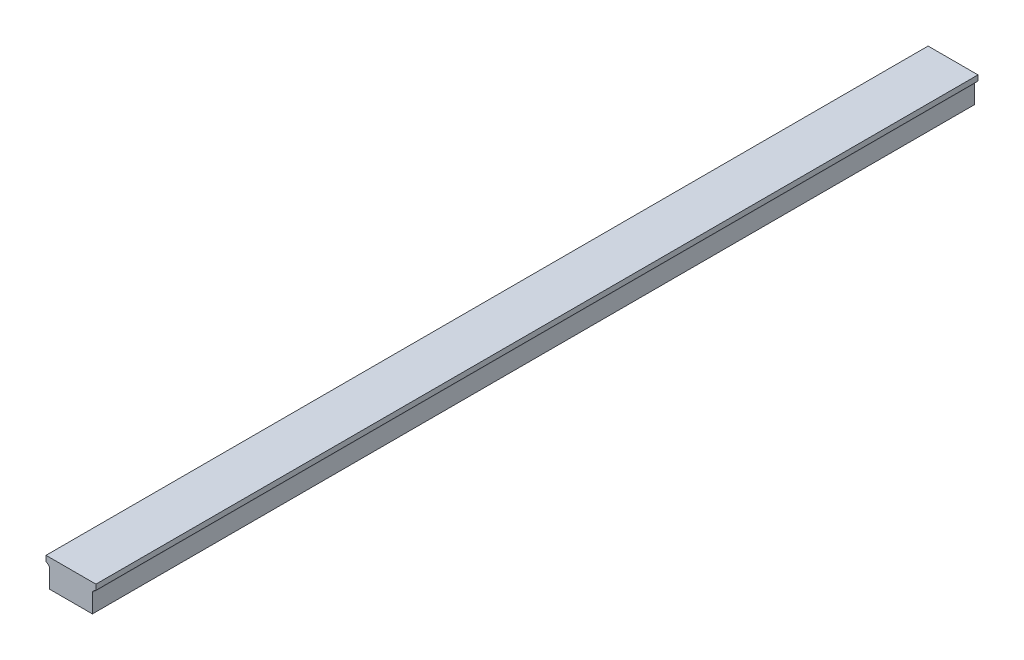
ISO-10303-21;
HEADER;
FILE_DESCRIPTION(('STEP AP214'),'2;1');
FILE_NAME('part.step','',(''),(''),'','','');
FILE_SCHEMA(('AUTOMOTIVE_DESIGN { 1 0 10303 214 1 1 1 1 }'));
ENDSEC;
DATA;
#1=APPLICATION_CONTEXT('core data for automotive mechanical design processes');
#2=APPLICATION_PROTOCOL_DEFINITION('international standard','automotive_design',2000,#1);
#3=PRODUCT_CONTEXT('',#1,'mechanical');
#4=PRODUCT('Part','Part','',(#3));
#5=PRODUCT_RELATED_PRODUCT_CATEGORY('part','',(#4));
#6=PRODUCT_DEFINITION_FORMATION('','',#4);
#7=PRODUCT_DEFINITION_CONTEXT('part definition',#1,'design');
#8=PRODUCT_DEFINITION('design','',#6,#7);
#9=PRODUCT_DEFINITION_SHAPE('','',#8);
#10=(LENGTH_UNIT() NAMED_UNIT(*) SI_UNIT(.MILLI.,.METRE.));
#11=(NAMED_UNIT(*) PLANE_ANGLE_UNIT() SI_UNIT($,.RADIAN.));
#12=(NAMED_UNIT(*) SI_UNIT($,.STERADIAN.) SOLID_ANGLE_UNIT());
#13=UNCERTAINTY_MEASURE_WITH_UNIT(LENGTH_MEASURE(1.E-05),#10,'distance_accuracy_value','');
#14=(GEOMETRIC_REPRESENTATION_CONTEXT(3) GLOBAL_UNCERTAINTY_ASSIGNED_CONTEXT((#13)) GLOBAL_UNIT_ASSIGNED_CONTEXT((#10,
#11,#12)) REPRESENTATION_CONTEXT('',''));
#15=CARTESIAN_POINT('',(0.,0.,0.));
#16=DIRECTION('',(0.,0.,1.));
#17=DIRECTION('',(1.,0.,0.));
#18=AXIS2_PLACEMENT_3D('',#15,#16,#17);
#19=CARTESIAN_POINT('',(-5.70000000210001,22.60000000118,-47.));
#20=DIRECTION('',(0.,-1.,0.));
#21=DIRECTION('',(0.,0.,-1.));
#22=AXIS2_PLACEMENT_3D('',#19,#20,#21);
#23=PLANE('',#22);
#24=DIRECTION('',(0.,0.,1.));
#25=VECTOR('',#24,1.);
#26=CARTESIAN_POINT('',(-5.70000000210001,22.60000000118,-47.));
#27=LINE('',#26,#25);
#28=CARTESIAN_POINT('',(-5.70000000210001,22.60000000118,-47.));
#29=VERTEX_POINT('',#28);
#30=CARTESIAN_POINT('',(-5.70000000210001,22.60000000118,154.45));
#31=VERTEX_POINT('',#30);
#32=EDGE_CURVE('E296',#29,#31,#27,.T.);
#33=ORIENTED_EDGE('',*,*,#32,.T.);
#34=DIRECTION('',(1.,0.,0.));
#35=VECTOR('',#34,1.);
#36=CARTESIAN_POINT('',(-5.70000000210001,22.60000000118,154.45));
#37=LINE('',#36,#35);
#38=CARTESIAN_POINT('',(5.70000000094,22.60000000118,154.45));
#39=VERTEX_POINT('',#38);
#40=EDGE_CURVE('E307',#31,#39,#37,.T.);
#41=ORIENTED_EDGE('',*,*,#40,.T.);
#42=DIRECTION('',(0.,0.,1.));
#43=VECTOR('',#42,1.);
#44=CARTESIAN_POINT('',(5.70000000094,22.60000000118,-47.));
#45=LINE('',#44,#43);
#46=CARTESIAN_POINT('',(5.70000000094,22.60000000118,-47.));
#47=VERTEX_POINT('',#46);
#48=EDGE_CURVE('E266',#47,#39,#45,.T.);
#49=ORIENTED_EDGE('',*,*,#48,.F.);
#50=DIRECTION('',(1.,0.,0.));
#51=VECTOR('',#50,1.);
#52=CARTESIAN_POINT('',(-5.70000000210001,22.60000000118,-47.));
#53=LINE('',#52,#51);
#54=EDGE_CURVE('E293',#29,#47,#53,.T.);
#55=ORIENTED_EDGE('',*,*,#54,.F.);
#56=EDGE_LOOP('',(#33,#41,#49,#55));
#57=FACE_BOUND('',#56,.T.);
#58=ADVANCED_FACE('F163',(#57),#23,.F.);
#59=CARTESIAN_POINT('',(5.49999999983665,20.5000000027981,-47.));
#60=DIRECTION('',(0.,0.,1.));
#61=DIRECTION('',(1.,0.,0.));
#62=AXIS2_PLACEMENT_3D('',#59,#60,#61);
#63=CYLINDRICAL_SURFACE('',#62,0.600000000000004);
#64=DIRECTION('',(0.,0.,1.));
#65=VECTOR('',#64,1.);
#66=CARTESIAN_POINT('',(5.15585413802603,20.9914912293715,-47.));
#67=LINE('',#66,#65);
#68=CARTESIAN_POINT('',(5.15585413802603,20.9914912293715,-47.));
#69=VERTEX_POINT('',#68);
#70=CARTESIAN_POINT('',(5.15585413802603,20.9914912293715,154.45));
#71=VERTEX_POINT('',#70);
#72=EDGE_CURVE('E315',#69,#71,#67,.T.);
#73=ORIENTED_EDGE('',*,*,#72,.T.);
#74=CARTESIAN_POINT('',(5.49999999983665,20.5000000027981,154.45));
#75=DIRECTION('',(0.,0.,-1.));
#76=DIRECTION('',(-1.,0.,0.));
#77=AXIS2_PLACEMENT_3D('',#74,#75,#76);
#78=CIRCLE('',#77,0.600000000000004);
#79=CARTESIAN_POINT('',(4.89999999983665,20.5000000027981,154.45));
#80=VERTEX_POINT('',#79);
#81=EDGE_CURVE('E322',#71,#80,#78,.F.);
#82=ORIENTED_EDGE('',*,*,#81,.T.);
#83=DIRECTION('',(0.,0.,1.));
#84=VECTOR('',#83,1.);
#85=CARTESIAN_POINT('',(4.89999999983665,20.5000000027981,-47.));
#86=LINE('',#85,#84);
#87=CARTESIAN_POINT('',(4.89999999983665,20.5000000027981,-47.));
#88=VERTEX_POINT('',#87);
#89=EDGE_CURVE('E280',#88,#80,#86,.T.);
#90=ORIENTED_EDGE('',*,*,#89,.F.);
#91=CARTESIAN_POINT('',(5.49999999983665,20.5000000027981,-47.));
#92=DIRECTION('',(0.,0.,1.));
#93=DIRECTION('',(1.,0.,0.));
#94=AXIS2_PLACEMENT_3D('',#91,#92,#93);
#95=CIRCLE('',#94,0.600000000000004);
#96=EDGE_CURVE('E264',#69,#88,#95,.T.);
#97=ORIENTED_EDGE('',*,*,#96,.F.);
#98=EDGE_LOOP('',(#73,#82,#90,#97));
#99=FACE_BOUND('',#98,.T.);
#100=ADVANCED_FACE('F338',(#99),#63,.F.);
#101=CARTESIAN_POINT('',(19.49999999916,-19.50000000004,-47.));
#102=DIRECTION('',(0.,0.,-1.));
#103=DIRECTION('',(-1.,0.,0.));
#104=AXIS2_PLACEMENT_3D('',#101,#102,#103);
#105=PLANE('',#104);
#106=DIRECTION('',(-1.,0.,0.));
#107=VECTOR('',#106,1.);
#108=CARTESIAN_POINT('',(9.95000000103665,16.3,-47.));
#109=LINE('',#108,#107);
#110=CARTESIAN_POINT('',(4.89999999983665,16.3,-47.));
#111=VERTEX_POINT('',#110);
#112=CARTESIAN_POINT('',(-4.89999999720113,16.3,-47.));
#113=VERTEX_POINT('',#112);
#114=EDGE_CURVE('E332',#111,#113,#109,.T.);
#115=ORIENTED_EDGE('',*,*,#114,.T.);
#116=DIRECTION('',(0.,1.,0.));
#117=VECTOR('',#116,1.);
#118=CARTESIAN_POINT('',(-4.89999999720113,20.5000000035114,-47.));
#119=LINE('',#118,#117);
#120=CARTESIAN_POINT('',(-4.89999999720113,20.5000000035114,-47.));
#121=VERTEX_POINT('',#120);
#122=EDGE_CURVE('E260',#113,#121,#119,.T.);
#123=ORIENTED_EDGE('',*,*,#122,.T.);
#124=CARTESIAN_POINT('',(-5.49999999720113,20.5000000035114,-47.));
#125=DIRECTION('',(0.,0.,1.));
#126=DIRECTION('',(1.,0.,0.));
#127=AXIS2_PLACEMENT_3D('',#124,#125,#126);
#128=CIRCLE('',#127,0.599999999999997);
#129=CARTESIAN_POINT('',(-5.1558541353905,20.9914912300848,-47.));
#130=VERTEX_POINT('',#129);
#131=EDGE_CURVE('E275',#121,#130,#128,.T.);
#132=ORIENTED_EDGE('',*,*,#131,.T.);
#133=DIRECTION('',(-0.819152044288992,0.573576436351045,0.));
#134=VECTOR('',#133,1.);
#135=CARTESIAN_POINT('',(-5.70000000210001,21.3725062678404,-47.));
#136=LINE('',#135,#134);
#137=CARTESIAN_POINT('',(-5.70000000210001,21.3725062678404,-47.));
#138=VERTEX_POINT('',#137);
#139=EDGE_CURVE('E186',#130,#138,#136,.T.);
#140=ORIENTED_EDGE('',*,*,#139,.T.);
#141=DIRECTION('',(0.,1.,0.));
#142=VECTOR('',#141,1.);
#143=CARTESIAN_POINT('',(-5.70000000210001,22.00000000118,-47.));
#144=LINE('',#143,#142);
#145=EDGE_CURVE('E278',#138,#29,#144,.T.);
#146=ORIENTED_EDGE('',*,*,#145,.T.);
#147=ORIENTED_EDGE('',*,*,#54,.T.);
#148=DIRECTION('',(0.,1.,0.));
#149=VECTOR('',#148,1.);
#150=CARTESIAN_POINT('',(5.70000000094,21.0000000027981,-47.));
#151=LINE('',#150,#149);
#152=CARTESIAN_POINT('',(5.70000000094,21.3725062644695,-47.));
#153=VERTEX_POINT('',#152);
#154=EDGE_CURVE('E261',#47,#153,#151,.F.);
#155=ORIENTED_EDGE('',*,*,#154,.T.);
#156=DIRECTION('',(-0.819152044288994,-0.573576436351043,0.));
#157=VECTOR('',#156,1.);
#158=CARTESIAN_POINT('',(5.70000000094,21.3725062644695,-47.));
#159=LINE('',#158,#157);
#160=EDGE_CURVE('E311',#153,#69,#159,.T.);
#161=ORIENTED_EDGE('',*,*,#160,.T.);
#162=ORIENTED_EDGE('',*,*,#96,.T.);
#163=DIRECTION('',(0.,-1.,0.));
#164=VECTOR('',#163,1.);
#165=CARTESIAN_POINT('',(4.89999999983665,17.5250000033581,-47.));
#166=LINE('',#165,#164);
#167=EDGE_CURVE('E271',#88,#111,#166,.T.);
#168=ORIENTED_EDGE('',*,*,#167,.T.);
#169=EDGE_LOOP('',(#115,#123,#132,#140,#146,#147,#155,#161,#162,#168));
#170=FACE_BOUND('',#169,.T.);
#171=ADVANCED_FACE('F165',(#170),#105,.T.);
#172=CARTESIAN_POINT('',(-5.70000000210001,22.00000000118,-47.));
#173=DIRECTION('',(1.,0.,0.));
#174=DIRECTION('',(0.,0.,-1.));
#175=AXIS2_PLACEMENT_3D('',#172,#173,#174);
#176=PLANE('',#175);
#177=DIRECTION('',(0.,0.,1.));
#178=VECTOR('',#177,1.);
#179=CARTESIAN_POINT('',(-5.70000000210001,21.3725062678404,-47.));
#180=LINE('',#179,#178);
#181=CARTESIAN_POINT('',(-5.70000000210001,21.3725062678404,154.45));
#182=VERTEX_POINT('',#181);
#183=EDGE_CURVE('E286',#138,#182,#180,.T.);
#184=ORIENTED_EDGE('',*,*,#183,.T.);
#185=DIRECTION('',(0.,1.,0.));
#186=VECTOR('',#185,1.);
#187=CARTESIAN_POINT('',(-5.70000000210001,22.00000000118,154.45));
#188=LINE('',#187,#186);
#189=EDGE_CURVE('E178',#182,#31,#188,.T.);
#190=ORIENTED_EDGE('',*,*,#189,.T.);
#191=ORIENTED_EDGE('',*,*,#32,.F.);
#192=ORIENTED_EDGE('',*,*,#145,.F.);
#193=EDGE_LOOP('',(#184,#190,#191,#192));
#194=FACE_BOUND('',#193,.T.);
#195=ADVANCED_FACE('F290',(#194),#176,.F.);
#196=CARTESIAN_POINT('',(-5.49999999720113,20.5000000035114,-47.));
#197=DIRECTION('',(0.,0.,1.));
#198=DIRECTION('',(1.,0.,0.));
#199=AXIS2_PLACEMENT_3D('',#196,#197,#198);
#200=CYLINDRICAL_SURFACE('',#199,0.599999999999997);
#201=DIRECTION('',(0.,0.,1.));
#202=VECTOR('',#201,1.);
#203=CARTESIAN_POINT('',(-4.89999999720113,20.5000000035114,-47.));
#204=LINE('',#203,#202);
#205=CARTESIAN_POINT('',(-4.89999999720113,20.5000000035114,154.45));
#206=VERTEX_POINT('',#205);
#207=EDGE_CURVE('E281',#121,#206,#204,.T.);
#208=ORIENTED_EDGE('',*,*,#207,.T.);
#209=CARTESIAN_POINT('',(-5.49999999720113,20.5000000035114,154.45));
#210=DIRECTION('',(0.,0.,-1.));
#211=DIRECTION('',(-1.,0.,0.));
#212=AXIS2_PLACEMENT_3D('',#209,#210,#211);
#213=CIRCLE('',#212,0.599999999999997);
#214=CARTESIAN_POINT('',(-5.1558541353905,20.9914912300848,154.45));
#215=VERTEX_POINT('',#214);
#216=EDGE_CURVE('E251',#206,#215,#213,.F.);
#217=ORIENTED_EDGE('',*,*,#216,.T.);
#218=DIRECTION('',(0.,0.,1.));
#219=VECTOR('',#218,1.);
#220=CARTESIAN_POINT('',(-5.1558541353905,20.9914912300848,-47.));
#221=LINE('',#220,#219);
#222=EDGE_CURVE('E287',#130,#215,#221,.T.);
#223=ORIENTED_EDGE('',*,*,#222,.F.);
#224=ORIENTED_EDGE('',*,*,#131,.F.);
#225=EDGE_LOOP('',(#208,#217,#223,#224));
#226=FACE_BOUND('',#225,.T.);
#227=ADVANCED_FACE('F362',(#226),#200,.F.);
#228=CARTESIAN_POINT('',(-4.89999999720113,20.5000000035114,-47.));
#229=DIRECTION('',(1.,0.,0.));
#230=DIRECTION('',(0.,1.,0.));
#231=AXIS2_PLACEMENT_3D('',#228,#229,#230);
#232=PLANE('',#231);
#233=DIRECTION('',(0.,0.,1.));
#234=VECTOR('',#233,1.);
#235=CARTESIAN_POINT('',(-4.89999999720113,16.30000000118,-47.));
#236=LINE('',#235,#234);
#237=CARTESIAN_POINT('',(-4.89999999720113,16.3,154.45));
#238=VERTEX_POINT('',#237);
#239=EDGE_CURVE('E242',#113,#238,#236,.T.);
#240=ORIENTED_EDGE('',*,*,#239,.T.);
#241=DIRECTION('',(0.,1.,0.));
#242=VECTOR('',#241,1.);
#243=CARTESIAN_POINT('',(-4.89999999720113,20.5000000035114,154.45));
#244=LINE('',#243,#242);
#245=EDGE_CURVE('E248',#238,#206,#244,.T.);
#246=ORIENTED_EDGE('',*,*,#245,.T.);
#247=ORIENTED_EDGE('',*,*,#207,.F.);
#248=ORIENTED_EDGE('',*,*,#122,.F.);
#249=EDGE_LOOP('',(#240,#246,#247,#248));
#250=FACE_BOUND('',#249,.T.);
#251=ADVANCED_FACE('F258',(#250),#232,.F.);
#252=CARTESIAN_POINT('',(4.89999999983665,17.5250000033581,-47.));
#253=DIRECTION('',(-1.,0.,0.));
#254=DIRECTION('',(0.,-1.,0.));
#255=AXIS2_PLACEMENT_3D('',#252,#253,#254);
#256=PLANE('',#255);
#257=ORIENTED_EDGE('',*,*,#89,.T.);
#258=DIRECTION('',(0.,-1.,0.));
#259=VECTOR('',#258,1.);
#260=CARTESIAN_POINT('',(4.89999999983665,17.5250000033581,154.45));
#261=LINE('',#260,#259);
#262=CARTESIAN_POINT('',(4.89999999983665,16.30000000118,154.45));
#263=VERTEX_POINT('',#262);
#264=EDGE_CURVE('E319',#80,#263,#261,.T.);
#265=ORIENTED_EDGE('',*,*,#264,.T.);
#266=DIRECTION('',(0.,0.,1.));
#267=VECTOR('',#266,1.);
#268=CARTESIAN_POINT('',(4.89999999983665,16.30000000118,-47.));
#269=LINE('',#268,#267);
#270=EDGE_CURVE('E245',#111,#263,#269,.T.);
#271=ORIENTED_EDGE('',*,*,#270,.F.);
#272=ORIENTED_EDGE('',*,*,#167,.F.);
#273=EDGE_LOOP('',(#257,#265,#271,#272));
#274=FACE_BOUND('',#273,.T.);
#275=ADVANCED_FACE('F336',(#274),#256,.F.);
#276=CARTESIAN_POINT('',(5.70000000094,21.0000000027981,-47.));
#277=DIRECTION('',(-1.,0.,0.));
#278=DIRECTION('',(0.,0.,1.));
#279=AXIS2_PLACEMENT_3D('',#276,#277,#278);
#280=PLANE('',#279);
#281=ORIENTED_EDGE('',*,*,#48,.T.);
#282=DIRECTION('',(0.,-1.,0.));
#283=VECTOR('',#282,1.);
#284=CARTESIAN_POINT('',(5.70000000094,21.0000000027981,154.45));
#285=LINE('',#284,#283);
#286=CARTESIAN_POINT('',(5.70000000094,21.3725062644695,154.45));
#287=VERTEX_POINT('',#286);
#288=EDGE_CURVE('E255',#39,#287,#285,.T.);
#289=ORIENTED_EDGE('',*,*,#288,.T.);
#290=DIRECTION('',(0.,0.,1.));
#291=VECTOR('',#290,1.);
#292=CARTESIAN_POINT('',(5.70000000094,21.3725062644695,-47.));
#293=LINE('',#292,#291);
#294=EDGE_CURVE('E312',#153,#287,#293,.T.);
#295=ORIENTED_EDGE('',*,*,#294,.F.);
#296=ORIENTED_EDGE('',*,*,#154,.F.);
#297=EDGE_LOOP('',(#281,#289,#295,#296));
#298=FACE_BOUND('',#297,.T.);
#299=ADVANCED_FACE('F343',(#298),#280,.F.);
#300=CARTESIAN_POINT('',(5.70000000094,21.3725062644695,-47.));
#301=DIRECTION('',(-0.573576436351043,0.819152044288994,0.));
#302=DIRECTION('',(-0.819152044288994,-0.573576436351043,0.));
#303=AXIS2_PLACEMENT_3D('',#300,#301,#302);
#304=PLANE('',#303);
#305=ORIENTED_EDGE('',*,*,#294,.T.);
#306=DIRECTION('',(-0.819152044288994,-0.573576436351043,0.));
#307=VECTOR('',#306,1.);
#308=CARTESIAN_POINT('',(5.70000000094,21.3725062644695,154.45));
#309=LINE('',#308,#307);
#310=EDGE_CURVE('E254',#287,#71,#309,.T.);
#311=ORIENTED_EDGE('',*,*,#310,.T.);
#312=ORIENTED_EDGE('',*,*,#72,.F.);
#313=ORIENTED_EDGE('',*,*,#160,.F.);
#314=EDGE_LOOP('',(#305,#311,#312,#313));
#315=FACE_BOUND('',#314,.T.);
#316=ADVANCED_FACE('F340',(#315),#304,.F.);
#317=CARTESIAN_POINT('',(-5.70000000210001,21.3725062678404,-47.));
#318=DIRECTION('',(0.573576436351045,0.819152044288992,0.));
#319=DIRECTION('',(-0.819152044288992,0.573576436351045,0.));
#320=AXIS2_PLACEMENT_3D('',#317,#318,#319);
#321=PLANE('',#320);
#322=ORIENTED_EDGE('',*,*,#222,.T.);
#323=DIRECTION('',(-0.819152044288992,0.573576436351045,0.));
#324=VECTOR('',#323,1.);
#325=CARTESIAN_POINT('',(-5.70000000210001,21.3725062678404,154.45));
#326=LINE('',#325,#324);
#327=EDGE_CURVE('E171',#215,#182,#326,.T.);
#328=ORIENTED_EDGE('',*,*,#327,.T.);
#329=ORIENTED_EDGE('',*,*,#183,.F.);
#330=ORIENTED_EDGE('',*,*,#139,.F.);
#331=EDGE_LOOP('',(#322,#328,#329,#330));
#332=FACE_BOUND('',#331,.T.);
#333=ADVANCED_FACE('F285',(#332),#321,.F.);
#334=CARTESIAN_POINT('',(-9.94999999726113,9.875,154.45));
#335=DIRECTION('',(0.,0.,-1.));
#336=DIRECTION('',(-1.,0.,0.));
#337=AXIS2_PLACEMENT_3D('',#334,#335,#336);
#338=PLANE('',#337);
#339=ORIENTED_EDGE('',*,*,#245,.F.);
#340=DIRECTION('',(1.,0.,0.));
#341=VECTOR('',#340,1.);
#342=CARTESIAN_POINT('',(-9.94999999726113,16.3,154.45));
#343=LINE('',#342,#341);
#344=EDGE_CURVE('E12',#238,#263,#343,.T.);
#345=ORIENTED_EDGE('',*,*,#344,.T.);
#346=ORIENTED_EDGE('',*,*,#264,.F.);
#347=ORIENTED_EDGE('',*,*,#81,.F.);
#348=ORIENTED_EDGE('',*,*,#310,.F.);
#349=ORIENTED_EDGE('',*,*,#288,.F.);
#350=ORIENTED_EDGE('',*,*,#40,.F.);
#351=ORIENTED_EDGE('',*,*,#189,.F.);
#352=ORIENTED_EDGE('',*,*,#327,.F.);
#353=ORIENTED_EDGE('',*,*,#216,.F.);
#354=EDGE_LOOP('',(#339,#345,#346,#347,#348,#349,#350,#351,#352,#353));
#355=FACE_BOUND('',#354,.T.);
#356=ADVANCED_FACE('F249',(#355),#338,.F.);
#357=CARTESIAN_POINT('',(9.95000000103665,16.3,-47.));
#358=DIRECTION('',(0.,1.,0.));
#359=DIRECTION('',(-1.,0.,0.));
#360=AXIS2_PLACEMENT_3D('',#357,#358,#359);
#361=PLANE('',#360);
#362=ORIENTED_EDGE('',*,*,#114,.F.);
#363=ORIENTED_EDGE('',*,*,#270,.T.);
#364=ORIENTED_EDGE('',*,*,#344,.F.);
#365=ORIENTED_EDGE('',*,*,#239,.F.);
#366=EDGE_LOOP('',(#362,#363,#364,#365));
#367=FACE_BOUND('',#366,.T.);
#368=ADVANCED_FACE('F240',(#367),#361,.F.);
#369=CLOSED_SHELL('',(#58,#100,#171,#195,#227,#251,#275,#299,#316,#333,#356,#368));
#370=MANIFOLD_SOLID_BREP('B2',#369);
#371=ADVANCED_BREP_SHAPE_REPRESENTATION('',(#18,#370),#14);
#372=SHAPE_DEFINITION_REPRESENTATION(#9,#371);
ENDSEC;
END-ISO-10303-21;
